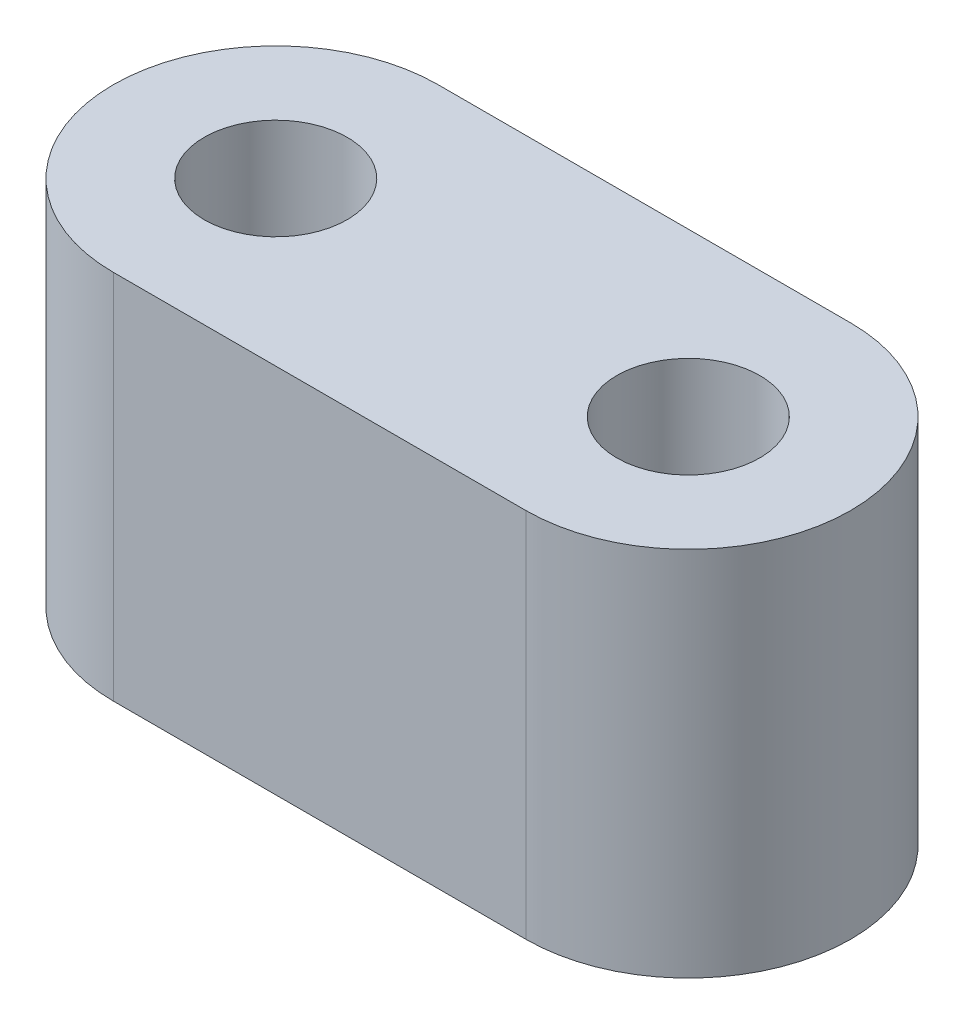
ISO-10303-21;
HEADER;
FILE_DESCRIPTION(('STEP AP214'),'2;1');
FILE_NAME('part.step','',(''),(''),'','','');
FILE_SCHEMA(('AUTOMOTIVE_DESIGN { 1 0 10303 214 1 1 1 1 }'));
ENDSEC;
DATA;
#1=APPLICATION_CONTEXT('core data for automotive mechanical design processes');
#2=APPLICATION_PROTOCOL_DEFINITION('international standard','automotive_design',2000,#1);
#3=PRODUCT_CONTEXT('',#1,'mechanical');
#4=PRODUCT('Part','Part','',(#3));
#5=PRODUCT_RELATED_PRODUCT_CATEGORY('part','',(#4));
#6=PRODUCT_DEFINITION_FORMATION('','',#4);
#7=PRODUCT_DEFINITION_CONTEXT('part definition',#1,'design');
#8=PRODUCT_DEFINITION('design','',#6,#7);
#9=PRODUCT_DEFINITION_SHAPE('','',#8);
#10=(LENGTH_UNIT() NAMED_UNIT(*) SI_UNIT(.MILLI.,.METRE.));
#11=(NAMED_UNIT(*) PLANE_ANGLE_UNIT() SI_UNIT($,.RADIAN.));
#12=(NAMED_UNIT(*) SI_UNIT($,.STERADIAN.) SOLID_ANGLE_UNIT());
#13=UNCERTAINTY_MEASURE_WITH_UNIT(LENGTH_MEASURE(1.E-05),#10,'distance_accuracy_value','');
#14=(GEOMETRIC_REPRESENTATION_CONTEXT(3) GLOBAL_UNCERTAINTY_ASSIGNED_CONTEXT((#13)) GLOBAL_UNIT_ASSIGNED_CONTEXT((#10,
#11,#12)) REPRESENTATION_CONTEXT('',''));
#15=CARTESIAN_POINT('',(0.,0.,0.));
#16=DIRECTION('',(0.,0.,1.));
#17=DIRECTION('',(1.,0.,0.));
#18=AXIS2_PLACEMENT_3D('',#15,#16,#17);
#19=CARTESIAN_POINT('',(0.,11.43,0.));
#20=DIRECTION('',(0.,1.,0.));
#21=DIRECTION('',(0.,0.,1.));
#22=AXIS2_PLACEMENT_3D('',#19,#20,#21);
#23=PLANE('',#22);
#24=CARTESIAN_POINT('',(0.,11.43,0.));
#25=DIRECTION('',(0.,1.,0.));
#26=DIRECTION('',(0.,0.,1.));
#27=AXIS2_PLACEMENT_3D('',#24,#25,#26);
#28=CIRCLE('',#27,2.2);
#29=CARTESIAN_POINT('',(0.,11.43,2.2));
#30=VERTEX_POINT('',#29);
#31=EDGE_CURVE('E103',#30,#30,#28,.T.);
#32=ORIENTED_EDGE('',*,*,#31,.F.);
#33=EDGE_LOOP('',(#32));
#34=FACE_BOUND('',#33,.T.);
#35=CARTESIAN_POINT('',(0.,11.43,0.));
#36=DIRECTION('',(0.,1.,0.));
#37=DIRECTION('',(0.,0.,1.));
#38=AXIS2_PLACEMENT_3D('',#35,#36,#37);
#39=CIRCLE('',#38,5.);
#40=CARTESIAN_POINT('',(0.,11.43,-5.));
#41=VERTEX_POINT('',#40);
#42=CARTESIAN_POINT('',(0.,11.43,5.));
#43=VERTEX_POINT('',#42);
#44=EDGE_CURVE('E88',#41,#43,#39,.T.);
#45=ORIENTED_EDGE('',*,*,#44,.T.);
#46=DIRECTION('',(1.,0.,0.));
#47=VECTOR('',#46,1.);
#48=CARTESIAN_POINT('',(0.,11.43,5.));
#49=LINE('',#48,#47);
#50=CARTESIAN_POINT('',(12.7,11.43,5.));
#51=VERTEX_POINT('',#50);
#52=EDGE_CURVE('E83',#43,#51,#49,.T.);
#53=ORIENTED_EDGE('',*,*,#52,.T.);
#54=CARTESIAN_POINT('',(12.7,11.43,0.));
#55=DIRECTION('',(0.,1.,0.));
#56=DIRECTION('',(0.,0.,1.));
#57=AXIS2_PLACEMENT_3D('',#54,#55,#56);
#58=CIRCLE('',#57,5.);
#59=CARTESIAN_POINT('',(12.7,11.43,-5.));
#60=VERTEX_POINT('',#59);
#61=EDGE_CURVE('E86',#51,#60,#58,.T.);
#62=ORIENTED_EDGE('',*,*,#61,.T.);
#63=DIRECTION('',(-1.,0.,0.));
#64=VECTOR('',#63,1.);
#65=CARTESIAN_POINT('',(0.,11.43,-5.));
#66=LINE('',#65,#64);
#67=EDGE_CURVE('E53',#60,#41,#66,.T.);
#68=ORIENTED_EDGE('',*,*,#67,.T.);
#69=EDGE_LOOP('',(#45,#53,#62,#68));
#70=FACE_BOUND('',#69,.T.);
#71=CARTESIAN_POINT('',(12.7,11.43,0.));
#72=DIRECTION('',(0.,1.,0.));
#73=DIRECTION('',(0.,0.,1.));
#74=AXIS2_PLACEMENT_3D('',#71,#72,#73);
#75=CIRCLE('',#74,2.2);
#76=CARTESIAN_POINT('',(12.7,11.43,2.2));
#77=VERTEX_POINT('',#76);
#78=EDGE_CURVE('E118',#77,#77,#75,.T.);
#79=ORIENTED_EDGE('',*,*,#78,.F.);
#80=EDGE_LOOP('',(#79));
#81=FACE_BOUND('',#80,.T.);
#82=ADVANCED_FACE('F36',(#34,#70,#81),#23,.T.);
#83=CARTESIAN_POINT('',(0.,0.,0.));
#84=DIRECTION('',(0.,1.,0.));
#85=DIRECTION('',(0.,0.,1.));
#86=AXIS2_PLACEMENT_3D('',#83,#84,#85);
#87=PLANE('',#86);
#88=CARTESIAN_POINT('',(0.,0.,0.));
#89=DIRECTION('',(0.,1.,0.));
#90=DIRECTION('',(0.,0.,1.));
#91=AXIS2_PLACEMENT_3D('',#88,#89,#90);
#92=CIRCLE('',#91,5.);
#93=CARTESIAN_POINT('',(0.,0.,-5.));
#94=VERTEX_POINT('',#93);
#95=CARTESIAN_POINT('',(0.,0.,5.));
#96=VERTEX_POINT('',#95);
#97=EDGE_CURVE('E100',#94,#96,#92,.T.);
#98=ORIENTED_EDGE('',*,*,#97,.F.);
#99=DIRECTION('',(-1.,0.,0.));
#100=VECTOR('',#99,1.);
#101=CARTESIAN_POINT('',(0.,0.,-5.));
#102=LINE('',#101,#100);
#103=CARTESIAN_POINT('',(12.7,0.,-5.));
#104=VERTEX_POINT('',#103);
#105=EDGE_CURVE('E76',#104,#94,#102,.T.);
#106=ORIENTED_EDGE('',*,*,#105,.F.);
#107=CARTESIAN_POINT('',(12.7,0.,0.));
#108=DIRECTION('',(0.,1.,0.));
#109=DIRECTION('',(0.,0.,1.));
#110=AXIS2_PLACEMENT_3D('',#107,#108,#109);
#111=CIRCLE('',#110,5.);
#112=CARTESIAN_POINT('',(12.7,0.,5.));
#113=VERTEX_POINT('',#112);
#114=EDGE_CURVE('E70',#113,#104,#111,.T.);
#115=ORIENTED_EDGE('',*,*,#114,.F.);
#116=DIRECTION('',(1.,0.,0.));
#117=VECTOR('',#116,1.);
#118=CARTESIAN_POINT('',(0.,0.,5.));
#119=LINE('',#118,#117);
#120=EDGE_CURVE('E92',#96,#113,#119,.T.);
#121=ORIENTED_EDGE('',*,*,#120,.F.);
#122=EDGE_LOOP('',(#98,#106,#115,#121));
#123=FACE_BOUND('',#122,.T.);
#124=CARTESIAN_POINT('',(0.,0.,0.));
#125=DIRECTION('',(0.,1.,0.));
#126=DIRECTION('',(0.,0.,1.));
#127=AXIS2_PLACEMENT_3D('',#124,#125,#126);
#128=CIRCLE('',#127,2.2);
#129=CARTESIAN_POINT('',(0.,0.,2.2));
#130=VERTEX_POINT('',#129);
#131=EDGE_CURVE('E115',#130,#130,#128,.T.);
#132=ORIENTED_EDGE('',*,*,#131,.T.);
#133=EDGE_LOOP('',(#132));
#134=FACE_BOUND('',#133,.T.);
#135=CARTESIAN_POINT('',(12.7,0.,0.));
#136=DIRECTION('',(0.,1.,0.));
#137=DIRECTION('',(0.,0.,1.));
#138=AXIS2_PLACEMENT_3D('',#135,#136,#137);
#139=CIRCLE('',#138,2.2);
#140=CARTESIAN_POINT('',(12.7,0.,2.2));
#141=VERTEX_POINT('',#140);
#142=EDGE_CURVE('E121',#141,#141,#139,.T.);
#143=ORIENTED_EDGE('',*,*,#142,.T.);
#144=EDGE_LOOP('',(#143));
#145=FACE_BOUND('',#144,.T.);
#146=ADVANCED_FACE('F111',(#123,#134,#145),#87,.F.);
#147=CARTESIAN_POINT('',(0.,11.43,0.));
#148=DIRECTION('',(0.,-1.,0.));
#149=DIRECTION('',(0.,0.,-1.));
#150=AXIS2_PLACEMENT_3D('',#147,#148,#149);
#151=CYLINDRICAL_SURFACE('',#150,5.);
#152=ORIENTED_EDGE('',*,*,#97,.T.);
#153=DIRECTION('',(0.,-1.,0.));
#154=VECTOR('',#153,1.);
#155=CARTESIAN_POINT('',(0.,11.43,5.));
#156=LINE('',#155,#154);
#157=EDGE_CURVE('E11',#43,#96,#156,.T.);
#158=ORIENTED_EDGE('',*,*,#157,.F.);
#159=ORIENTED_EDGE('',*,*,#44,.F.);
#160=DIRECTION('',(0.,-1.,0.));
#161=VECTOR('',#160,1.);
#162=CARTESIAN_POINT('',(0.,11.43,-5.));
#163=LINE('',#162,#161);
#164=EDGE_CURVE('E96',#41,#94,#163,.T.);
#165=ORIENTED_EDGE('',*,*,#164,.T.);
#166=EDGE_LOOP('',(#152,#158,#159,#165));
#167=FACE_BOUND('',#166,.T.);
#168=ADVANCED_FACE('F38',(#167),#151,.T.);
#169=CARTESIAN_POINT('',(0.,11.43,5.));
#170=DIRECTION('',(0.,0.,-1.));
#171=DIRECTION('',(-1.,0.,0.));
#172=AXIS2_PLACEMENT_3D('',#169,#170,#171);
#173=PLANE('',#172);
#174=ORIENTED_EDGE('',*,*,#120,.T.);
#175=DIRECTION('',(0.,-1.,0.));
#176=VECTOR('',#175,1.);
#177=CARTESIAN_POINT('',(12.7,11.43,5.));
#178=LINE('',#177,#176);
#179=EDGE_CURVE('E45',#51,#113,#178,.T.);
#180=ORIENTED_EDGE('',*,*,#179,.F.);
#181=ORIENTED_EDGE('',*,*,#52,.F.);
#182=ORIENTED_EDGE('',*,*,#157,.T.);
#183=EDGE_LOOP('',(#174,#180,#181,#182));
#184=FACE_BOUND('',#183,.T.);
#185=ADVANCED_FACE('F91',(#184),#173,.F.);
#186=CARTESIAN_POINT('',(12.7,11.43,0.));
#187=DIRECTION('',(0.,-1.,0.));
#188=DIRECTION('',(0.,0.,-1.));
#189=AXIS2_PLACEMENT_3D('',#186,#187,#188);
#190=CYLINDRICAL_SURFACE('',#189,5.);
#191=ORIENTED_EDGE('',*,*,#114,.T.);
#192=DIRECTION('',(0.,-1.,0.));
#193=VECTOR('',#192,1.);
#194=CARTESIAN_POINT('',(12.7,11.43,-5.));
#195=LINE('',#194,#193);
#196=EDGE_CURVE('E93',#60,#104,#195,.T.);
#197=ORIENTED_EDGE('',*,*,#196,.F.);
#198=ORIENTED_EDGE('',*,*,#61,.F.);
#199=ORIENTED_EDGE('',*,*,#179,.T.);
#200=EDGE_LOOP('',(#191,#197,#198,#199));
#201=FACE_BOUND('',#200,.T.);
#202=ADVANCED_FACE('F94',(#201),#190,.T.);
#203=CARTESIAN_POINT('',(0.,11.43,-5.));
#204=DIRECTION('',(0.,0.,1.));
#205=DIRECTION('',(1.,0.,0.));
#206=AXIS2_PLACEMENT_3D('',#203,#204,#205);
#207=PLANE('',#206);
#208=ORIENTED_EDGE('',*,*,#105,.T.);
#209=ORIENTED_EDGE('',*,*,#164,.F.);
#210=ORIENTED_EDGE('',*,*,#67,.F.);
#211=ORIENTED_EDGE('',*,*,#196,.T.);
#212=EDGE_LOOP('',(#208,#209,#210,#211));
#213=FACE_BOUND('',#212,.T.);
#214=ADVANCED_FACE('F108',(#213),#207,.F.);
#215=CARTESIAN_POINT('',(0.,11.43,0.));
#216=DIRECTION('',(0.,-1.,0.));
#217=DIRECTION('',(0.,0.,-1.));
#218=AXIS2_PLACEMENT_3D('',#215,#216,#217);
#219=CYLINDRICAL_SURFACE('',#218,2.2);
#220=ORIENTED_EDGE('',*,*,#31,.T.);
#221=EDGE_LOOP('',(#220));
#222=FACE_BOUND('',#221,.T.);
#223=ORIENTED_EDGE('',*,*,#131,.F.);
#224=EDGE_LOOP('',(#223));
#225=FACE_BOUND('',#224,.T.);
#226=ADVANCED_FACE('F138',(#222,#225),#219,.F.);
#227=CARTESIAN_POINT('',(12.7,11.43,0.));
#228=DIRECTION('',(0.,-1.,0.));
#229=DIRECTION('',(0.,0.,-1.));
#230=AXIS2_PLACEMENT_3D('',#227,#228,#229);
#231=CYLINDRICAL_SURFACE('',#230,2.2);
#232=ORIENTED_EDGE('',*,*,#78,.T.);
#233=EDGE_LOOP('',(#232));
#234=FACE_BOUND('',#233,.T.);
#235=ORIENTED_EDGE('',*,*,#142,.F.);
#236=EDGE_LOOP('',(#235));
#237=FACE_BOUND('',#236,.T.);
#238=ADVANCED_FACE('F127',(#234,#237),#231,.F.);
#239=CLOSED_SHELL('',(#82,#146,#168,#185,#202,#214,#226,#238));
#240=MANIFOLD_SOLID_BREP('B2',#239);
#241=ADVANCED_BREP_SHAPE_REPRESENTATION('',(#18,#240),#14);
#242=SHAPE_DEFINITION_REPRESENTATION(#9,#241);
ENDSEC;
END-ISO-10303-21;
